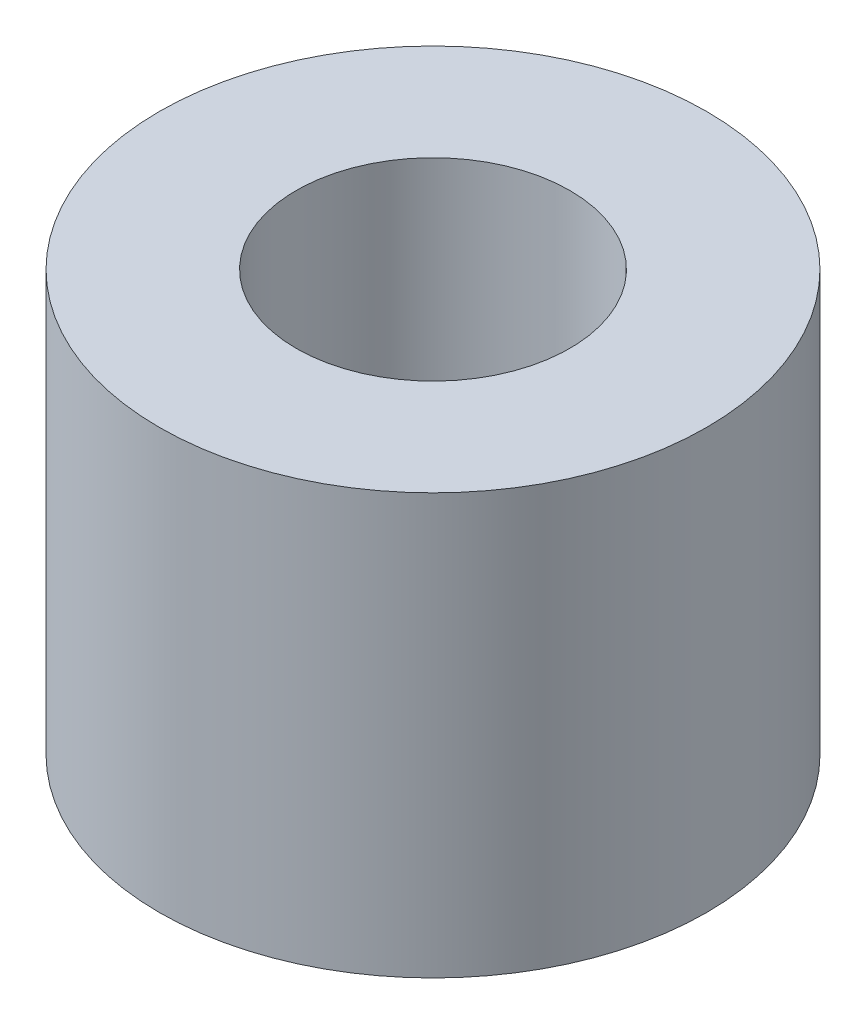
ISO-10303-21;
HEADER;
FILE_DESCRIPTION(('STEP AP214'),'2;1');
FILE_NAME('part.step','',(''),(''),'','','');
FILE_SCHEMA(('AUTOMOTIVE_DESIGN { 1 0 10303 214 1 1 1 1 }'));
ENDSEC;
DATA;
#1=APPLICATION_CONTEXT('core data for automotive mechanical design processes');
#2=APPLICATION_PROTOCOL_DEFINITION('international standard','automotive_design',2000,#1);
#3=PRODUCT_CONTEXT('',#1,'mechanical');
#4=PRODUCT('Part','Part','',(#3));
#5=PRODUCT_RELATED_PRODUCT_CATEGORY('part','',(#4));
#6=PRODUCT_DEFINITION_FORMATION('','',#4);
#7=PRODUCT_DEFINITION_CONTEXT('part definition',#1,'design');
#8=PRODUCT_DEFINITION('design','',#6,#7);
#9=PRODUCT_DEFINITION_SHAPE('','',#8);
#10=(LENGTH_UNIT() NAMED_UNIT(*) SI_UNIT(.MILLI.,.METRE.));
#11=(NAMED_UNIT(*) PLANE_ANGLE_UNIT() SI_UNIT($,.RADIAN.));
#12=(NAMED_UNIT(*) SI_UNIT($,.STERADIAN.) SOLID_ANGLE_UNIT());
#13=UNCERTAINTY_MEASURE_WITH_UNIT(LENGTH_MEASURE(1.E-05),#10,'distance_accuracy_value','');
#14=(GEOMETRIC_REPRESENTATION_CONTEXT(3) GLOBAL_UNCERTAINTY_ASSIGNED_CONTEXT((#13)) GLOBAL_UNIT_ASSIGNED_CONTEXT((#10,
#11,#12)) REPRESENTATION_CONTEXT('',''));
#15=CARTESIAN_POINT('',(0.,0.,0.));
#16=DIRECTION('',(0.,0.,1.));
#17=DIRECTION('',(1.,0.,0.));
#18=AXIS2_PLACEMENT_3D('',#15,#16,#17);
#19=CARTESIAN_POINT('',(0.,9.75,0.));
#20=DIRECTION('',(0.,1.,0.));
#21=DIRECTION('',(0.,0.,1.));
#22=AXIS2_PLACEMENT_3D('',#19,#20,#21);
#23=PLANE('',#22);
#24=CARTESIAN_POINT('',(0.,9.75,0.));
#25=DIRECTION('',(0.,1.,0.));
#26=DIRECTION('',(0.,0.,1.));
#27=AXIS2_PLACEMENT_3D('',#24,#25,#26);
#28=CIRCLE('',#27,6.35);
#29=CARTESIAN_POINT('',(0.,9.75,6.35));
#30=VERTEX_POINT('',#29);
#31=EDGE_CURVE('E10',#30,#30,#28,.T.);
#32=ORIENTED_EDGE('',*,*,#31,.T.);
#33=EDGE_LOOP('',(#32));
#34=FACE_BOUND('',#33,.T.);
#35=CARTESIAN_POINT('',(0.,9.75,0.));
#36=DIRECTION('',(0.,1.,0.));
#37=DIRECTION('',(0.,0.,1.));
#38=AXIS2_PLACEMENT_3D('',#35,#36,#37);
#39=CIRCLE('',#38,3.175);
#40=CARTESIAN_POINT('',(0.,9.75,3.175));
#41=VERTEX_POINT('',#40);
#42=EDGE_CURVE('E56',#41,#41,#39,.T.);
#43=ORIENTED_EDGE('',*,*,#42,.F.);
#44=EDGE_LOOP('',(#43));
#45=FACE_BOUND('',#44,.T.);
#46=ADVANCED_FACE('F43',(#34,#45),#23,.T.);
#47=CARTESIAN_POINT('',(0.,0.,0.));
#48=DIRECTION('',(0.,1.,0.));
#49=DIRECTION('',(0.,0.,1.));
#50=AXIS2_PLACEMENT_3D('',#47,#48,#49);
#51=PLANE('',#50);
#52=CARTESIAN_POINT('',(0.,0.,0.));
#53=DIRECTION('',(0.,1.,0.));
#54=DIRECTION('',(0.,0.,1.));
#55=AXIS2_PLACEMENT_3D('',#52,#53,#54);
#56=CIRCLE('',#55,6.35);
#57=CARTESIAN_POINT('',(0.,0.,6.35));
#58=VERTEX_POINT('',#57);
#59=EDGE_CURVE('E47',#58,#58,#56,.T.);
#60=ORIENTED_EDGE('',*,*,#59,.F.);
#61=EDGE_LOOP('',(#60));
#62=FACE_BOUND('',#61,.T.);
#63=CARTESIAN_POINT('',(0.,0.,0.));
#64=DIRECTION('',(0.,1.,0.));
#65=DIRECTION('',(0.,0.,1.));
#66=AXIS2_PLACEMENT_3D('',#63,#64,#65);
#67=CIRCLE('',#66,3.175);
#68=CARTESIAN_POINT('',(0.,0.,3.175));
#69=VERTEX_POINT('',#68);
#70=EDGE_CURVE('E58',#69,#69,#67,.T.);
#71=ORIENTED_EDGE('',*,*,#70,.T.);
#72=EDGE_LOOP('',(#71));
#73=FACE_BOUND('',#72,.T.);
#74=ADVANCED_FACE('F70',(#62,#73),#51,.F.);
#75=CARTESIAN_POINT('',(0.,9.75,0.));
#76=DIRECTION('',(0.,-1.,0.));
#77=DIRECTION('',(0.,0.,-1.));
#78=AXIS2_PLACEMENT_3D('',#75,#76,#77);
#79=CYLINDRICAL_SURFACE('',#78,6.35);
#80=ORIENTED_EDGE('',*,*,#31,.F.);
#81=EDGE_LOOP('',(#80));
#82=FACE_BOUND('',#81,.T.);
#83=ORIENTED_EDGE('',*,*,#59,.T.);
#84=EDGE_LOOP('',(#83));
#85=FACE_BOUND('',#84,.T.);
#86=ADVANCED_FACE('F45',(#82,#85),#79,.T.);
#87=CARTESIAN_POINT('',(0.,9.75,0.));
#88=DIRECTION('',(0.,-1.,0.));
#89=DIRECTION('',(0.,0.,-1.));
#90=AXIS2_PLACEMENT_3D('',#87,#88,#89);
#91=CYLINDRICAL_SURFACE('',#90,3.175);
#92=ORIENTED_EDGE('',*,*,#42,.T.);
#93=EDGE_LOOP('',(#92));
#94=FACE_BOUND('',#93,.T.);
#95=ORIENTED_EDGE('',*,*,#70,.F.);
#96=EDGE_LOOP('',(#95));
#97=FACE_BOUND('',#96,.T.);
#98=ADVANCED_FACE('F66',(#94,#97),#91,.F.);
#99=CLOSED_SHELL('',(#46,#74,#86,#98));
#100=MANIFOLD_SOLID_BREP('B2',#99);
#101=ADVANCED_BREP_SHAPE_REPRESENTATION('',(#18,#100),#14);
#102=SHAPE_DEFINITION_REPRESENTATION(#9,#101);
ENDSEC;
END-ISO-10303-21;
